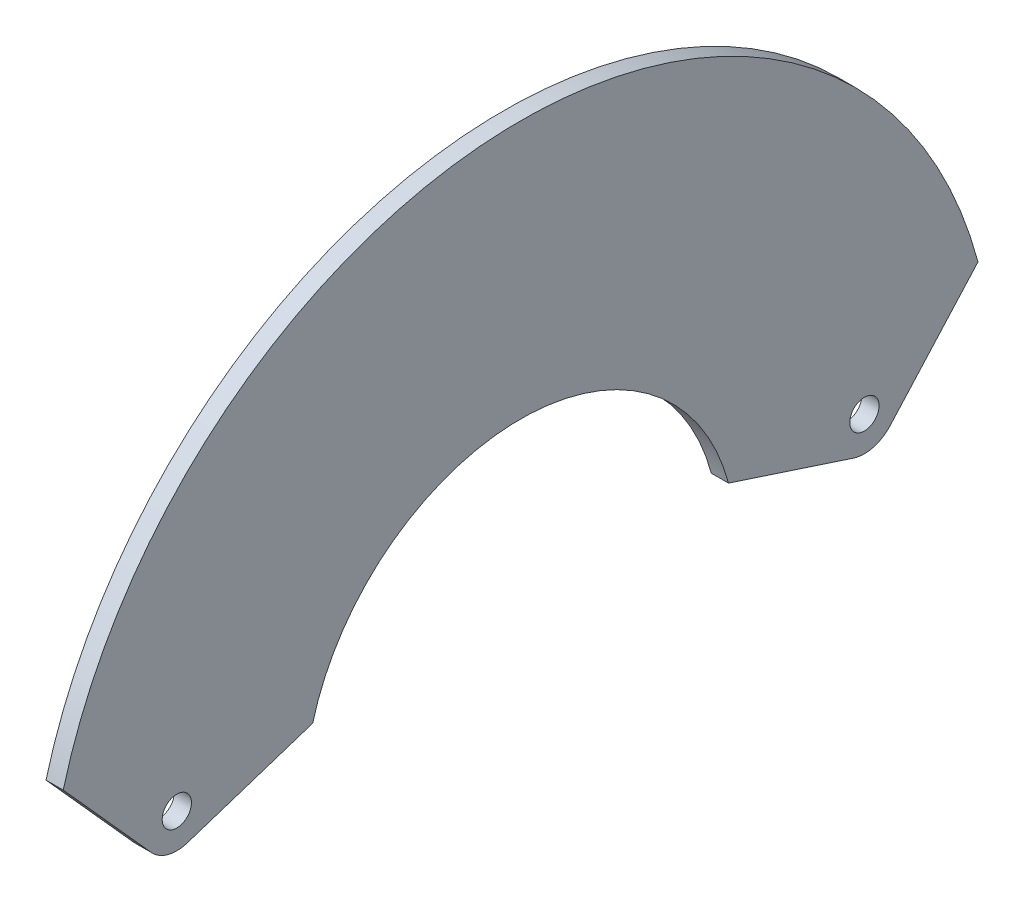
ISO-10303-21;
HEADER;
FILE_DESCRIPTION(('STEP AP214'),'2;1');
FILE_NAME('part.step','',(''),(''),'','','');
FILE_SCHEMA(('AUTOMOTIVE_DESIGN { 1 0 10303 214 1 1 1 1 }'));
ENDSEC;
DATA;
#1=APPLICATION_CONTEXT('core data for automotive mechanical design processes');
#2=APPLICATION_PROTOCOL_DEFINITION('international standard','automotive_design',2000,#1);
#3=PRODUCT_CONTEXT('',#1,'mechanical');
#4=PRODUCT('Part','Part','',(#3));
#5=PRODUCT_RELATED_PRODUCT_CATEGORY('part','',(#4));
#6=PRODUCT_DEFINITION_FORMATION('','',#4);
#7=PRODUCT_DEFINITION_CONTEXT('part definition',#1,'design');
#8=PRODUCT_DEFINITION('design','',#6,#7);
#9=PRODUCT_DEFINITION_SHAPE('','',#8);
#10=(LENGTH_UNIT() NAMED_UNIT(*) SI_UNIT(.MILLI.,.METRE.));
#11=(NAMED_UNIT(*) PLANE_ANGLE_UNIT() SI_UNIT($,.RADIAN.));
#12=(NAMED_UNIT(*) SI_UNIT($,.STERADIAN.) SOLID_ANGLE_UNIT());
#13=UNCERTAINTY_MEASURE_WITH_UNIT(LENGTH_MEASURE(1.E-05),#10,'distance_accuracy_value','');
#14=(GEOMETRIC_REPRESENTATION_CONTEXT(3) GLOBAL_UNCERTAINTY_ASSIGNED_CONTEXT((#13)) GLOBAL_UNIT_ASSIGNED_CONTEXT((#10,
#11,#12)) REPRESENTATION_CONTEXT('',''));
#15=CARTESIAN_POINT('',(0.,0.,0.));
#16=DIRECTION('',(0.,0.,1.));
#17=DIRECTION('',(1.,0.,0.));
#18=AXIS2_PLACEMENT_3D('',#15,#16,#17);
#19=CARTESIAN_POINT('',(-2.,60.,0.));
#20=DIRECTION('',(1.,0.,0.));
#21=DIRECTION('',(0.,0.,1.));
#22=AXIS2_PLACEMENT_3D('',#19,#20,#21);
#23=CYLINDRICAL_SURFACE('',#22,25.);
#24=CARTESIAN_POINT('',(0.,60.,0.));
#25=DIRECTION('',(-1.,0.,0.));
#26=DIRECTION('',(0.,0.,1.));
#27=AXIS2_PLACEMENT_3D('',#24,#25,#26);
#28=CIRCLE('',#27,25.);
#29=CARTESIAN_POINT('',(0.,66.470476127563,24.1481456572267));
#30=VERTEX_POINT('',#29);
#31=CARTESIAN_POINT('',(0.,66.470476127563,-24.1481456572267));
#32=VERTEX_POINT('',#31);
#33=EDGE_CURVE('E159',#30,#32,#28,.T.);
#34=ORIENTED_EDGE('',*,*,#33,.F.);
#35=DIRECTION('',(1.,0.,0.));
#36=VECTOR('',#35,1.);
#37=CARTESIAN_POINT('',(-2.,66.470476127563,24.1481456572267));
#38=LINE('',#37,#36);
#39=CARTESIAN_POINT('',(-2.,66.470476127563,24.1481456572267));
#40=VERTEX_POINT('',#39);
#41=EDGE_CURVE('E46',#40,#30,#38,.T.);
#42=ORIENTED_EDGE('',*,*,#41,.F.);
#43=CARTESIAN_POINT('',(-2.,60.,0.));
#44=DIRECTION('',(-1.,0.,0.));
#45=DIRECTION('',(0.,0.,1.));
#46=AXIS2_PLACEMENT_3D('',#43,#44,#45);
#47=CIRCLE('',#46,25.);
#48=CARTESIAN_POINT('',(-2.,66.470476127563,-24.1481456572267));
#49=VERTEX_POINT('',#48);
#50=EDGE_CURVE('E182',#40,#49,#47,.T.);
#51=ORIENTED_EDGE('',*,*,#50,.T.);
#52=DIRECTION('',(1.,0.,0.));
#53=VECTOR('',#52,1.);
#54=CARTESIAN_POINT('',(-2.,66.470476127563,-24.1481456572267));
#55=LINE('',#54,#53);
#56=EDGE_CURVE('E11',#49,#32,#55,.T.);
#57=ORIENTED_EDGE('',*,*,#56,.T.);
#58=EDGE_LOOP('',(#34,#42,#51,#57));
#59=FACE_BOUND('',#58,.T.);
#60=ADVANCED_FACE('F43',(#59),#23,.F.);
#61=CARTESIAN_POINT('',(-2.,67.1895641076807,-21.9466624955386));
#62=DIRECTION('',(0.,-0.950575341057126,0.310493995069354));
#63=DIRECTION('',(0.,0.310493995069354,0.950575341057126));
#64=AXIS2_PLACEMENT_3D('',#61,#62,#63);
#65=PLANE('',#64);
#66=DIRECTION('',(0.,0.310493995069354,0.950575341057126));
#67=VECTOR('',#66,1.);
#68=CARTESIAN_POINT('',(0.,67.1895641076807,-21.9466624955386));
#69=LINE('',#68,#67);
#70=CARTESIAN_POINT('',(0.,61.720831308427,-38.6891522967979));
#71=VERTEX_POINT('',#70);
#72=EDGE_CURVE('E100',#71,#32,#69,.T.);
#73=ORIENTED_EDGE('',*,*,#72,.T.);
#74=ORIENTED_EDGE('',*,*,#56,.F.);
#75=DIRECTION('',(0.,0.310493995069354,0.950575341057126));
#76=VECTOR('',#75,1.);
#77=CARTESIAN_POINT('',(-2.,67.1895641076807,-21.9466624955386));
#78=LINE('',#77,#76);
#79=CARTESIAN_POINT('',(-2.,61.720831308427,-38.6891522967979));
#80=VERTEX_POINT('',#79);
#81=EDGE_CURVE('E61',#80,#49,#78,.T.);
#82=ORIENTED_EDGE('',*,*,#81,.F.);
#83=DIRECTION('',(1.,0.,0.));
#84=VECTOR('',#83,1.);
#85=CARTESIAN_POINT('',(-2.,61.720831308427,-38.6891522967979));
#86=LINE('',#85,#84);
#87=EDGE_CURVE('E52',#80,#71,#86,.T.);
#88=ORIENTED_EDGE('',*,*,#87,.T.);
#89=EDGE_LOOP('',(#73,#74,#82,#88));
#90=FACE_BOUND('',#89,.T.);
#91=ADVANCED_FACE('F231',(#90),#65,.T.);
#92=CARTESIAN_POINT('',(-2.,65.5231326726555,-39.9311282770753));
#93=DIRECTION('',(1.,0.,0.));
#94=DIRECTION('',(0.,0.,1.));
#95=AXIS2_PLACEMENT_3D('',#92,#93,#94);
#96=CYLINDRICAL_SURFACE('',#95,4.00000000000002);
#97=CARTESIAN_POINT('',(0.,65.5231326726555,-39.9311282770753));
#98=DIRECTION('',(-1.,0.,0.));
#99=DIRECTION('',(0.,0.,1.));
#100=AXIS2_PLACEMENT_3D('',#97,#98,#99);
#101=CIRCLE('',#100,4.00000000000002);
#102=CARTESIAN_POINT('',(0.,62.8512310885281,-42.9078617089999));
#103=VERTEX_POINT('',#102);
#104=EDGE_CURVE('E94',#103,#71,#101,.T.);
#105=ORIENTED_EDGE('',*,*,#104,.T.);
#106=ORIENTED_EDGE('',*,*,#87,.F.);
#107=CARTESIAN_POINT('',(-2.,65.5231326726555,-39.9311282770753));
#108=DIRECTION('',(-1.,0.,0.));
#109=DIRECTION('',(0.,0.,1.));
#110=AXIS2_PLACEMENT_3D('',#107,#108,#109);
#111=CIRCLE('',#110,4.00000000000002);
#112=CARTESIAN_POINT('',(-2.,62.8512310885281,-42.9078617089999));
#113=VERTEX_POINT('',#112);
#114=EDGE_CURVE('E128',#113,#80,#111,.T.);
#115=ORIENTED_EDGE('',*,*,#114,.F.);
#116=DIRECTION('',(1.,0.,0.));
#117=VECTOR('',#116,1.);
#118=CARTESIAN_POINT('',(-2.,62.8512310885281,-42.9078617089999));
#119=LINE('',#118,#117);
#120=EDGE_CURVE('E136',#113,#103,#119,.T.);
#121=ORIENTED_EDGE('',*,*,#120,.T.);
#122=EDGE_LOOP('',(#105,#106,#115,#121));
#123=FACE_BOUND('',#122,.T.);
#124=ADVANCED_FACE('F143',(#123),#96,.T.);
#125=CARTESIAN_POINT('',(-2.,6.71432794402526,7.48035203939323));
#126=DIRECTION('',(0.,0.667975396031851,0.744183357981145));
#127=DIRECTION('',(0.,0.744183357981145,-0.667975396031851));
#128=AXIS2_PLACEMENT_3D('',#125,#126,#127);
#129=PLANE('',#128);
#130=DIRECTION('',(0.,0.744183357981145,-0.667975396031851));
#131=VECTOR('',#130,1.);
#132=CARTESIAN_POINT('',(0.,6.71432794402526,7.48035203939323));
#133=LINE('',#132,#131);
#134=CARTESIAN_POINT('',(0.,74.2350474806387,-53.1259204458988));
#135=VERTEX_POINT('',#134);
#136=EDGE_CURVE('E139',#103,#135,#133,.T.);
#137=ORIENTED_EDGE('',*,*,#136,.F.);
#138=ORIENTED_EDGE('',*,*,#120,.F.);
#139=DIRECTION('',(0.,0.744183357981145,-0.667975396031851));
#140=VECTOR('',#139,1.);
#141=CARTESIAN_POINT('',(-2.,6.71432794402526,7.48035203939323));
#142=LINE('',#141,#140);
#143=CARTESIAN_POINT('',(-2.,74.2350474806387,-53.1259204458988));
#144=VERTEX_POINT('',#143);
#145=EDGE_CURVE('E123',#113,#144,#142,.T.);
#146=ORIENTED_EDGE('',*,*,#145,.T.);
#147=DIRECTION('',(1.,0.,0.));
#148=VECTOR('',#147,1.);
#149=CARTESIAN_POINT('',(-2.,74.2350474806387,-53.1259204458988));
#150=LINE('',#149,#148);
#151=EDGE_CURVE('E141',#144,#135,#150,.T.);
#152=ORIENTED_EDGE('',*,*,#151,.T.);
#153=EDGE_LOOP('',(#137,#138,#146,#152));
#154=FACE_BOUND('',#153,.T.);
#155=ADVANCED_FACE('F137',(#154),#129,.F.);
#156=CARTESIAN_POINT('',(-2.,60.,0.));
#157=DIRECTION('',(1.,0.,0.));
#158=DIRECTION('',(0.,0.,1.));
#159=AXIS2_PLACEMENT_3D('',#156,#157,#158);
#160=CYLINDRICAL_SURFACE('',#159,55.);
#161=CARTESIAN_POINT('',(0.,60.,0.));
#162=DIRECTION('',(-1.,0.,0.));
#163=DIRECTION('',(0.,0.,1.));
#164=AXIS2_PLACEMENT_3D('',#161,#162,#163);
#165=CIRCLE('',#164,55.);
#166=CARTESIAN_POINT('',(0.,74.2350474806386,53.1259204458987));
#167=VERTEX_POINT('',#166);
#168=EDGE_CURVE('E169',#167,#135,#165,.T.);
#169=ORIENTED_EDGE('',*,*,#168,.T.);
#170=ORIENTED_EDGE('',*,*,#151,.F.);
#171=CARTESIAN_POINT('',(-2.,60.,0.));
#172=DIRECTION('',(-1.,0.,0.));
#173=DIRECTION('',(0.,0.,1.));
#174=AXIS2_PLACEMENT_3D('',#171,#172,#173);
#175=CIRCLE('',#174,55.);
#176=CARTESIAN_POINT('',(-2.,74.2350474806386,53.1259204458987));
#177=VERTEX_POINT('',#176);
#178=EDGE_CURVE('E130',#177,#144,#175,.T.);
#179=ORIENTED_EDGE('',*,*,#178,.F.);
#180=DIRECTION('',(1.,0.,0.));
#181=VECTOR('',#180,1.);
#182=CARTESIAN_POINT('',(-2.,74.2350474806386,53.1259204458987));
#183=LINE('',#182,#181);
#184=EDGE_CURVE('E188',#177,#167,#183,.T.);
#185=ORIENTED_EDGE('',*,*,#184,.T.);
#186=EDGE_LOOP('',(#169,#170,#179,#185));
#187=FACE_BOUND('',#186,.T.);
#188=ADVANCED_FACE('F221',(#187),#160,.T.);
#189=CARTESIAN_POINT('',(-2.,6.71432794402524,-7.48035203939321));
#190=DIRECTION('',(0.,-0.66797539603185,0.744183357981145));
#191=DIRECTION('',(0.,0.744183357981145,0.66797539603185));
#192=AXIS2_PLACEMENT_3D('',#189,#190,#191);
#193=PLANE('',#192);
#194=DIRECTION('',(0.,0.744183357981145,0.66797539603185));
#195=VECTOR('',#194,1.);
#196=CARTESIAN_POINT('',(0.,6.71432794402524,-7.48035203939321));
#197=LINE('',#196,#195);
#198=CARTESIAN_POINT('',(0.,62.8512310885281,42.9078617089999));
#199=VERTEX_POINT('',#198);
#200=EDGE_CURVE('E167',#199,#167,#197,.T.);
#201=ORIENTED_EDGE('',*,*,#200,.T.);
#202=ORIENTED_EDGE('',*,*,#184,.F.);
#203=DIRECTION('',(0.,0.744183357981145,0.66797539603185));
#204=VECTOR('',#203,1.);
#205=CARTESIAN_POINT('',(-2.,6.71432794402524,-7.48035203939321));
#206=LINE('',#205,#204);
#207=CARTESIAN_POINT('',(-2.,62.8512310885281,42.9078617089999));
#208=VERTEX_POINT('',#207);
#209=EDGE_CURVE('E213',#208,#177,#206,.T.);
#210=ORIENTED_EDGE('',*,*,#209,.F.);
#211=DIRECTION('',(1.,0.,0.));
#212=VECTOR('',#211,1.);
#213=CARTESIAN_POINT('',(-2.,62.8512310885281,42.9078617089999));
#214=LINE('',#213,#212);
#215=EDGE_CURVE('E191',#208,#199,#214,.T.);
#216=ORIENTED_EDGE('',*,*,#215,.T.);
#217=EDGE_LOOP('',(#201,#202,#210,#216));
#218=FACE_BOUND('',#217,.T.);
#219=ADVANCED_FACE('F211',(#218),#193,.T.);
#220=CARTESIAN_POINT('',(-2.,65.5231326726555,39.9311282770753));
#221=DIRECTION('',(1.,0.,0.));
#222=DIRECTION('',(0.,0.,1.));
#223=AXIS2_PLACEMENT_3D('',#220,#221,#222);
#224=CYLINDRICAL_SURFACE('',#223,4.00000000000002);
#225=CARTESIAN_POINT('',(0.,65.5231326726555,39.9311282770753));
#226=DIRECTION('',(-1.,0.,0.));
#227=DIRECTION('',(0.,0.,1.));
#228=AXIS2_PLACEMENT_3D('',#225,#226,#227);
#229=CIRCLE('',#228,4.00000000000002);
#230=CARTESIAN_POINT('',(0.,61.720831308427,38.6891522967979));
#231=VERTEX_POINT('',#230);
#232=EDGE_CURVE('E164',#199,#231,#229,.F.);
#233=ORIENTED_EDGE('',*,*,#232,.F.);
#234=ORIENTED_EDGE('',*,*,#215,.F.);
#235=CARTESIAN_POINT('',(-2.,65.5231326726555,39.9311282770753));
#236=DIRECTION('',(-1.,0.,0.));
#237=DIRECTION('',(0.,0.,1.));
#238=AXIS2_PLACEMENT_3D('',#235,#236,#237);
#239=CIRCLE('',#238,4.00000000000002);
#240=CARTESIAN_POINT('',(-2.,61.720831308427,38.6891522967979));
#241=VERTEX_POINT('',#240);
#242=EDGE_CURVE('E214',#208,#241,#239,.F.);
#243=ORIENTED_EDGE('',*,*,#242,.T.);
#244=DIRECTION('',(1.,0.,0.));
#245=VECTOR('',#244,1.);
#246=CARTESIAN_POINT('',(-2.,61.720831308427,38.6891522967979));
#247=LINE('',#246,#245);
#248=EDGE_CURVE('E193',#241,#231,#247,.T.);
#249=ORIENTED_EDGE('',*,*,#248,.T.);
#250=EDGE_LOOP('',(#233,#234,#243,#249));
#251=FACE_BOUND('',#250,.T.);
#252=ADVANCED_FACE('F208',(#251),#224,.T.);
#253=CARTESIAN_POINT('',(-2.,65.5231326726555,-39.9311282770753));
#254=DIRECTION('',(1.,0.,0.));
#255=DIRECTION('',(0.,0.,1.));
#256=AXIS2_PLACEMENT_3D('',#253,#254,#255);
#257=CYLINDRICAL_SURFACE('',#256,1.7);
#258=CARTESIAN_POINT('',(-2.,65.5231326726555,-39.9311282770753));
#259=DIRECTION('',(-1.,0.,0.));
#260=DIRECTION('',(0.,0.,1.));
#261=AXIS2_PLACEMENT_3D('',#258,#259,#260);
#262=CIRCLE('',#261,1.7);
#263=CARTESIAN_POINT('',(-2.,65.5231326726555,-38.2311282770753));
#264=VERTEX_POINT('',#263);
#265=EDGE_CURVE('E149',#264,#264,#262,.T.);
#266=ORIENTED_EDGE('',*,*,#265,.T.);
#267=EDGE_LOOP('',(#266));
#268=FACE_BOUND('',#267,.T.);
#269=CARTESIAN_POINT('',(0.,65.5231326726555,-39.9311282770753));
#270=DIRECTION('',(-1.,0.,0.));
#271=DIRECTION('',(0.,0.,1.));
#272=AXIS2_PLACEMENT_3D('',#269,#270,#271);
#273=CIRCLE('',#272,1.7);
#274=CARTESIAN_POINT('',(0.,65.5231326726555,-38.2311282770753));
#275=VERTEX_POINT('',#274);
#276=EDGE_CURVE('E177',#275,#275,#273,.T.);
#277=ORIENTED_EDGE('',*,*,#276,.F.);
#278=EDGE_LOOP('',(#277));
#279=FACE_BOUND('',#278,.T.);
#280=ADVANCED_FACE('F241',(#268,#279),#257,.F.);
#281=CARTESIAN_POINT('',(-2.,67.1895641076807,21.9466624955386));
#282=DIRECTION('',(0.,0.950575341057126,0.310493995069354));
#283=DIRECTION('',(0.,0.310493995069354,-0.950575341057126));
#284=AXIS2_PLACEMENT_3D('',#281,#282,#283);
#285=PLANE('',#284);
#286=DIRECTION('',(0.,0.310493995069354,-0.950575341057126));
#287=VECTOR('',#286,1.);
#288=CARTESIAN_POINT('',(0.,67.1895641076807,21.9466624955386));
#289=LINE('',#288,#287);
#290=EDGE_CURVE('E162',#231,#30,#289,.T.);
#291=ORIENTED_EDGE('',*,*,#290,.F.);
#292=ORIENTED_EDGE('',*,*,#248,.F.);
#293=DIRECTION('',(0.,0.310493995069354,-0.950575341057126));
#294=VECTOR('',#293,1.);
#295=CARTESIAN_POINT('',(-2.,67.1895641076807,21.9466624955386));
#296=LINE('',#295,#294);
#297=EDGE_CURVE('E108',#241,#40,#296,.T.);
#298=ORIENTED_EDGE('',*,*,#297,.T.);
#299=ORIENTED_EDGE('',*,*,#41,.T.);
#300=EDGE_LOOP('',(#291,#292,#298,#299));
#301=FACE_BOUND('',#300,.T.);
#302=ADVANCED_FACE('F199',(#301),#285,.F.);
#303=CARTESIAN_POINT('',(-2.,65.5231326726555,39.9311282770753));
#304=DIRECTION('',(1.,0.,0.));
#305=DIRECTION('',(0.,0.,1.));
#306=AXIS2_PLACEMENT_3D('',#303,#304,#305);
#307=CYLINDRICAL_SURFACE('',#306,1.7);
#308=CARTESIAN_POINT('',(-2.,65.5231326726555,39.9311282770753));
#309=DIRECTION('',(-1.,0.,0.));
#310=DIRECTION('',(0.,0.,1.));
#311=AXIS2_PLACEMENT_3D('',#308,#309,#310);
#312=CIRCLE('',#311,1.7);
#313=CARTESIAN_POINT('',(-2.,65.5231326726555,41.6311282770753));
#314=VERTEX_POINT('',#313);
#315=EDGE_CURVE('E156',#314,#314,#312,.T.);
#316=ORIENTED_EDGE('',*,*,#315,.T.);
#317=EDGE_LOOP('',(#316));
#318=FACE_BOUND('',#317,.T.);
#319=CARTESIAN_POINT('',(0.,65.5231326726555,39.9311282770753));
#320=DIRECTION('',(-1.,0.,0.));
#321=DIRECTION('',(0.,0.,1.));
#322=AXIS2_PLACEMENT_3D('',#319,#320,#321);
#323=CIRCLE('',#322,1.7);
#324=CARTESIAN_POINT('',(0.,65.5231326726555,41.6311282770753));
#325=VERTEX_POINT('',#324);
#326=EDGE_CURVE('E180',#325,#325,#323,.T.);
#327=ORIENTED_EDGE('',*,*,#326,.F.);
#328=EDGE_LOOP('',(#327));
#329=FACE_BOUND('',#328,.T.);
#330=ADVANCED_FACE('F245',(#318,#329),#307,.F.);
#331=CARTESIAN_POINT('',(-2.,0.,0.));
#332=DIRECTION('',(1.,0.,0.));
#333=DIRECTION('',(0.,0.,1.));
#334=AXIS2_PLACEMENT_3D('',#331,#332,#333);
#335=PLANE('',#334);
#336=ORIENTED_EDGE('',*,*,#50,.F.);
#337=ORIENTED_EDGE('',*,*,#297,.F.);
#338=ORIENTED_EDGE('',*,*,#242,.F.);
#339=ORIENTED_EDGE('',*,*,#209,.T.);
#340=ORIENTED_EDGE('',*,*,#178,.T.);
#341=ORIENTED_EDGE('',*,*,#145,.F.);
#342=ORIENTED_EDGE('',*,*,#114,.T.);
#343=ORIENTED_EDGE('',*,*,#81,.T.);
#344=EDGE_LOOP('',(#336,#337,#338,#339,#340,#341,#342,#343));
#345=FACE_BOUND('',#344,.T.);
#346=ORIENTED_EDGE('',*,*,#265,.F.);
#347=EDGE_LOOP('',(#346));
#348=FACE_BOUND('',#347,.T.);
#349=ORIENTED_EDGE('',*,*,#315,.F.);
#350=EDGE_LOOP('',(#349));
#351=FACE_BOUND('',#350,.T.);
#352=ADVANCED_FACE('F125',(#345,#348,#351),#335,.F.);
#353=CARTESIAN_POINT('',(0.,0.,0.));
#354=DIRECTION('',(1.,0.,0.));
#355=DIRECTION('',(0.,0.,1.));
#356=AXIS2_PLACEMENT_3D('',#353,#354,#355);
#357=PLANE('',#356);
#358=ORIENTED_EDGE('',*,*,#33,.T.);
#359=ORIENTED_EDGE('',*,*,#72,.F.);
#360=ORIENTED_EDGE('',*,*,#104,.F.);
#361=ORIENTED_EDGE('',*,*,#136,.T.);
#362=ORIENTED_EDGE('',*,*,#168,.F.);
#363=ORIENTED_EDGE('',*,*,#200,.F.);
#364=ORIENTED_EDGE('',*,*,#232,.T.);
#365=ORIENTED_EDGE('',*,*,#290,.T.);
#366=EDGE_LOOP('',(#358,#359,#360,#361,#362,#363,#364,#365));
#367=FACE_BOUND('',#366,.T.);
#368=ORIENTED_EDGE('',*,*,#276,.T.);
#369=EDGE_LOOP('',(#368));
#370=FACE_BOUND('',#369,.T.);
#371=ORIENTED_EDGE('',*,*,#326,.T.);
#372=EDGE_LOOP('',(#371));
#373=FACE_BOUND('',#372,.T.);
#374=ADVANCED_FACE('F203',(#367,#370,#373),#357,.T.);
#375=CLOSED_SHELL('',(#60,#91,#124,#155,#188,#219,#252,#280,#302,#330,#352,#374));
#376=MANIFOLD_SOLID_BREP('B2',#375);
#377=ADVANCED_BREP_SHAPE_REPRESENTATION('',(#18,#376),#14);
#378=SHAPE_DEFINITION_REPRESENTATION(#9,#377);
ENDSEC;
END-ISO-10303-21;
